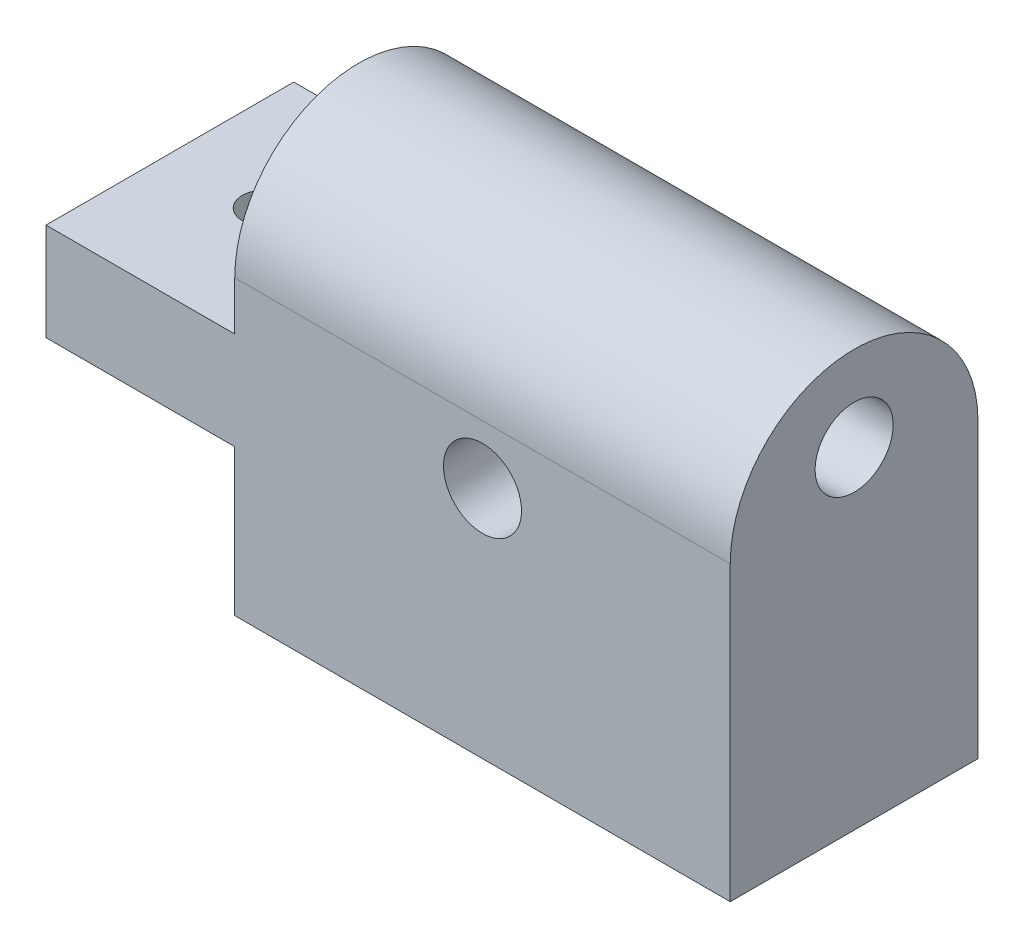
ISO-10303-21;
HEADER;
FILE_DESCRIPTION(('STEP AP214'),'2;1');
FILE_NAME('part.step','',(''),(''),'','','');
FILE_SCHEMA(('AUTOMOTIVE_DESIGN { 1 0 10303 214 1 1 1 1 }'));
ENDSEC;
DATA;
#1=APPLICATION_CONTEXT('core data for automotive mechanical design processes');
#2=APPLICATION_PROTOCOL_DEFINITION('international standard','automotive_design',2000,#1);
#3=PRODUCT_CONTEXT('',#1,'mechanical');
#4=PRODUCT('Part','Part','',(#3));
#5=PRODUCT_RELATED_PRODUCT_CATEGORY('part','',(#4));
#6=PRODUCT_DEFINITION_FORMATION('','',#4);
#7=PRODUCT_DEFINITION_CONTEXT('part definition',#1,'design');
#8=PRODUCT_DEFINITION('design','',#6,#7);
#9=PRODUCT_DEFINITION_SHAPE('','',#8);
#10=(LENGTH_UNIT() NAMED_UNIT(*) SI_UNIT(.MILLI.,.METRE.));
#11=(NAMED_UNIT(*) PLANE_ANGLE_UNIT() SI_UNIT($,.RADIAN.));
#12=(NAMED_UNIT(*) SI_UNIT($,.STERADIAN.) SOLID_ANGLE_UNIT());
#13=UNCERTAINTY_MEASURE_WITH_UNIT(LENGTH_MEASURE(1.E-05),#10,'distance_accuracy_value','');
#14=(GEOMETRIC_REPRESENTATION_CONTEXT(3) GLOBAL_UNCERTAINTY_ASSIGNED_CONTEXT((#13)) GLOBAL_UNIT_ASSIGNED_CONTEXT((#10,
#11,#12)) REPRESENTATION_CONTEXT('',''));
#15=CARTESIAN_POINT('',(0.,0.,0.));
#16=DIRECTION('',(0.,0.,1.));
#17=DIRECTION('',(1.,0.,0.));
#18=AXIS2_PLACEMENT_3D('',#15,#16,#17);
#19=CARTESIAN_POINT('',(-25.4,5.99999999999999,25.4));
#20=DIRECTION('',(1.,0.,0.));
#21=DIRECTION('',(0.,1.,0.));
#22=AXIS2_PLACEMENT_3D('',#19,#20,#21);
#23=PLANE('',#22);
#24=CARTESIAN_POINT('',(-25.4,10.,12.7));
#25=DIRECTION('',(1.,0.,0.));
#26=DIRECTION('',(0.,1.,0.));
#27=AXIS2_PLACEMENT_3D('',#24,#25,#26);
#28=CIRCLE('',#27,4.);
#29=CARTESIAN_POINT('',(-25.4,14.,12.7));
#30=VERTEX_POINT('',#29);
#31=EDGE_CURVE('E127',#30,#30,#28,.T.);
#32=ORIENTED_EDGE('',*,*,#31,.T.);
#33=EDGE_LOOP('',(#32));
#34=FACE_BOUND('',#33,.T.);
#35=DIRECTION('',(0.,0.,-1.));
#36=VECTOR('',#35,1.);
#37=CARTESIAN_POINT('',(-25.4,1.,25.4));
#38=LINE('',#37,#36);
#39=CARTESIAN_POINT('',(-25.4,0.999999999999998,25.4));
#40=VERTEX_POINT('',#39);
#41=CARTESIAN_POINT('',(-25.4,0.999999999999998,0.));
#42=VERTEX_POINT('',#41);
#43=EDGE_CURVE('E118',#40,#42,#38,.T.);
#44=ORIENTED_EDGE('',*,*,#43,.F.);
#45=DIRECTION('',(0.,-1.,0.));
#46=VECTOR('',#45,1.);
#47=CARTESIAN_POINT('',(-25.4,5.99999999999999,25.4));
#48=LINE('',#47,#46);
#49=CARTESIAN_POINT('',(-25.4,5.99999999999999,25.4));
#50=VERTEX_POINT('',#49);
#51=EDGE_CURVE('E147',#50,#40,#48,.T.);
#52=ORIENTED_EDGE('',*,*,#51,.F.);
#53=CARTESIAN_POINT('',(-25.4,6.,12.7));
#54=DIRECTION('',(1.,0.,0.));
#55=DIRECTION('',(0.,1.,0.));
#56=AXIS2_PLACEMENT_3D('',#53,#54,#55);
#57=CIRCLE('',#56,12.7);
#58=CARTESIAN_POINT('',(-25.4,5.99999999999999,0.));
#59=VERTEX_POINT('',#58);
#60=EDGE_CURVE('E136',#59,#50,#57,.T.);
#61=ORIENTED_EDGE('',*,*,#60,.F.);
#62=DIRECTION('',(0.,-1.,0.));
#63=VECTOR('',#62,1.);
#64=CARTESIAN_POINT('',(-25.4,5.99999999999999,0.));
#65=LINE('',#64,#63);
#66=EDGE_CURVE('E57',#59,#42,#65,.T.);
#67=ORIENTED_EDGE('',*,*,#66,.T.);
#68=EDGE_LOOP('',(#44,#52,#61,#67));
#69=FACE_BOUND('',#68,.T.);
#70=ADVANCED_FACE('F34',(#34,#69),#23,.F.);
#71=DIRECTION('',(0.,0.,1.));
#72=VECTOR('',#71,1.);
#73=CARTESIAN_POINT('',(-25.4,-9.,25.4));
#74=LINE('',#73,#72);
#75=CARTESIAN_POINT('',(-25.4,-9.,0.));
#76=VERTEX_POINT('',#75);
#77=CARTESIAN_POINT('',(-25.4,-9.,25.4));
#78=VERTEX_POINT('',#77);
#79=EDGE_CURVE('E49',#76,#78,#74,.T.);
#80=ORIENTED_EDGE('',*,*,#79,.F.);
#81=CARTESIAN_POINT('',(-25.4,-24.,0.));
#82=VERTEX_POINT('',#81);
#83=EDGE_CURVE('E123',#76,#82,#65,.T.);
#84=ORIENTED_EDGE('',*,*,#83,.T.);
#85=DIRECTION('',(0.,0.,-1.));
#86=VECTOR('',#85,1.);
#87=CARTESIAN_POINT('',(-25.4,-24.,25.4));
#88=LINE('',#87,#86);
#89=CARTESIAN_POINT('',(-25.4,-24.,25.4));
#90=VERTEX_POINT('',#89);
#91=EDGE_CURVE('E11',#90,#82,#88,.T.);
#92=ORIENTED_EDGE('',*,*,#91,.F.);
#93=EDGE_CURVE('E151',#78,#90,#48,.T.);
#94=ORIENTED_EDGE('',*,*,#93,.F.);
#95=EDGE_LOOP('',(#80,#84,#92,#94));
#96=FACE_BOUND('',#95,.T.);
#97=ADVANCED_FACE('F210',(#96),#23,.F.);
#98=CARTESIAN_POINT('',(0.,0.,25.4));
#99=DIRECTION('',(0.,0.,1.));
#100=DIRECTION('',(1.,0.,0.));
#101=AXIS2_PLACEMENT_3D('',#98,#99,#100);
#102=PLANE('',#101);
#103=DIRECTION('',(0.,1.,0.));
#104=VECTOR('',#103,1.);
#105=CARTESIAN_POINT('',(25.4,-24.,25.4));
#106=LINE('',#105,#104);
#107=CARTESIAN_POINT('',(25.4,-24.,25.4));
#108=VERTEX_POINT('',#107);
#109=CARTESIAN_POINT('',(25.4,5.99999999999999,25.4));
#110=VERTEX_POINT('',#109);
#111=EDGE_CURVE('E153',#108,#110,#106,.T.);
#112=ORIENTED_EDGE('',*,*,#111,.T.);
#113=DIRECTION('',(-1.,0.,0.));
#114=VECTOR('',#113,1.);
#115=CARTESIAN_POINT('',(25.4,5.99999999999999,25.4));
#116=LINE('',#115,#114);
#117=EDGE_CURVE('E155',#110,#50,#116,.T.);
#118=ORIENTED_EDGE('',*,*,#117,.T.);
#119=ORIENTED_EDGE('',*,*,#51,.T.);
#120=DIRECTION('',(1.,0.,0.));
#121=VECTOR('',#120,1.);
#122=CARTESIAN_POINT('',(-44.7499994,0.999999999999996,25.4));
#123=LINE('',#122,#121);
#124=CARTESIAN_POINT('',(-44.7499994,0.999999999999996,25.4));
#125=VERTEX_POINT('',#124);
#126=EDGE_CURVE('E129',#125,#40,#123,.T.);
#127=ORIENTED_EDGE('',*,*,#126,.F.);
#128=DIRECTION('',(0.,1.,0.));
#129=VECTOR('',#128,1.);
#130=CARTESIAN_POINT('',(-44.7499994,-9.00000000000001,25.4));
#131=LINE('',#130,#129);
#132=CARTESIAN_POINT('',(-44.7499994,-9.00000000000001,25.4));
#133=VERTEX_POINT('',#132);
#134=EDGE_CURVE('E108',#133,#125,#131,.T.);
#135=ORIENTED_EDGE('',*,*,#134,.F.);
#136=DIRECTION('',(1.,0.,0.));
#137=VECTOR('',#136,1.);
#138=CARTESIAN_POINT('',(-44.7499994,-9.00000000000001,25.4));
#139=LINE('',#138,#137);
#140=EDGE_CURVE('E105',#133,#78,#139,.T.);
#141=ORIENTED_EDGE('',*,*,#140,.T.);
#142=ORIENTED_EDGE('',*,*,#93,.T.);
#143=DIRECTION('',(1.,0.,0.));
#144=VECTOR('',#143,1.);
#145=CARTESIAN_POINT('',(-25.4,-24.,25.4));
#146=LINE('',#145,#144);
#147=EDGE_CURVE('E150',#90,#108,#146,.T.);
#148=ORIENTED_EDGE('',*,*,#147,.T.);
#149=EDGE_LOOP('',(#112,#118,#119,#127,#135,#141,#142,#148));
#150=FACE_BOUND('',#149,.T.);
#151=CARTESIAN_POINT('',(0.,0.,25.4));
#152=DIRECTION('',(0.,0.,1.));
#153=DIRECTION('',(1.,0.,0.));
#154=AXIS2_PLACEMENT_3D('',#151,#152,#153);
#155=CIRCLE('',#154,4.);
#156=CARTESIAN_POINT('',(4.,0.,25.4));
#157=VERTEX_POINT('',#156);
#158=EDGE_CURVE('E142',#157,#157,#155,.T.);
#159=ORIENTED_EDGE('',*,*,#158,.F.);
#160=EDGE_LOOP('',(#159));
#161=FACE_BOUND('',#160,.T.);
#162=ADVANCED_FACE('F181',(#150,#161),#102,.T.);
#163=CARTESIAN_POINT('',(0.,0.,0.));
#164=DIRECTION('',(0.,0.,1.));
#165=DIRECTION('',(1.,0.,0.));
#166=AXIS2_PLACEMENT_3D('',#163,#164,#165);
#167=PLANE('',#166);
#168=DIRECTION('',(1.,0.,0.));
#169=VECTOR('',#168,1.);
#170=CARTESIAN_POINT('',(-25.4,-24.,0.));
#171=LINE('',#170,#169);
#172=CARTESIAN_POINT('',(25.4,-24.,0.));
#173=VERTEX_POINT('',#172);
#174=EDGE_CURVE('E158',#82,#173,#171,.T.);
#175=ORIENTED_EDGE('',*,*,#174,.F.);
#176=ORIENTED_EDGE('',*,*,#83,.F.);
#177=DIRECTION('',(1.,0.,0.));
#178=VECTOR('',#177,1.);
#179=CARTESIAN_POINT('',(-44.7499994,-9.00000000000001,0.));
#180=LINE('',#179,#178);
#181=CARTESIAN_POINT('',(-44.7499994,-9.00000000000001,0.));
#182=VERTEX_POINT('',#181);
#183=EDGE_CURVE('E103',#182,#76,#180,.T.);
#184=ORIENTED_EDGE('',*,*,#183,.F.);
#185=DIRECTION('',(0.,-1.,0.));
#186=VECTOR('',#185,1.);
#187=CARTESIAN_POINT('',(-44.7499994,-9.00000000000001,0.));
#188=LINE('',#187,#186);
#189=CARTESIAN_POINT('',(-44.7499994,0.999999999999992,0.));
#190=VERTEX_POINT('',#189);
#191=EDGE_CURVE('E109',#190,#182,#188,.T.);
#192=ORIENTED_EDGE('',*,*,#191,.F.);
#193=DIRECTION('',(1.,0.,0.));
#194=VECTOR('',#193,1.);
#195=CARTESIAN_POINT('',(-44.7499994,0.999999999999992,0.));
#196=LINE('',#195,#194);
#197=EDGE_CURVE('E190',#190,#42,#196,.T.);
#198=ORIENTED_EDGE('',*,*,#197,.T.);
#199=ORIENTED_EDGE('',*,*,#66,.F.);
#200=DIRECTION('',(-1.,0.,0.));
#201=VECTOR('',#200,1.);
#202=CARTESIAN_POINT('',(25.4,5.99999999999999,0.));
#203=LINE('',#202,#201);
#204=CARTESIAN_POINT('',(25.4,5.99999999999999,0.));
#205=VERTEX_POINT('',#204);
#206=EDGE_CURVE('E162',#205,#59,#203,.T.);
#207=ORIENTED_EDGE('',*,*,#206,.F.);
#208=DIRECTION('',(0.,1.,0.));
#209=VECTOR('',#208,1.);
#210=CARTESIAN_POINT('',(25.4,-24.,0.));
#211=LINE('',#210,#209);
#212=EDGE_CURVE('E160',#173,#205,#211,.T.);
#213=ORIENTED_EDGE('',*,*,#212,.F.);
#214=EDGE_LOOP('',(#175,#176,#184,#192,#198,#199,#207,#213));
#215=FACE_BOUND('',#214,.T.);
#216=CARTESIAN_POINT('',(0.,0.,0.));
#217=DIRECTION('',(0.,0.,1.));
#218=DIRECTION('',(1.,0.,0.));
#219=AXIS2_PLACEMENT_3D('',#216,#217,#218);
#220=CIRCLE('',#219,4.);
#221=CARTESIAN_POINT('',(4.,0.,0.));
#222=VERTEX_POINT('',#221);
#223=EDGE_CURVE('E139',#222,#222,#220,.T.);
#224=ORIENTED_EDGE('',*,*,#223,.T.);
#225=EDGE_LOOP('',(#224));
#226=FACE_BOUND('',#225,.T.);
#227=ADVANCED_FACE('F121',(#215,#226),#167,.F.);
#228=CARTESIAN_POINT('',(-25.4,-24.,25.4));
#229=DIRECTION('',(0.,1.,0.));
#230=DIRECTION('',(0.,0.,1.));
#231=AXIS2_PLACEMENT_3D('',#228,#229,#230);
#232=PLANE('',#231);
#233=ORIENTED_EDGE('',*,*,#174,.T.);
#234=DIRECTION('',(0.,0.,-1.));
#235=VECTOR('',#234,1.);
#236=CARTESIAN_POINT('',(25.4,-24.,25.4));
#237=LINE('',#236,#235);
#238=EDGE_CURVE('E42',#108,#173,#237,.T.);
#239=ORIENTED_EDGE('',*,*,#238,.F.);
#240=ORIENTED_EDGE('',*,*,#147,.F.);
#241=ORIENTED_EDGE('',*,*,#91,.T.);
#242=EDGE_LOOP('',(#233,#239,#240,#241));
#243=FACE_BOUND('',#242,.T.);
#244=ADVANCED_FACE('F238',(#243),#232,.F.);
#245=CARTESIAN_POINT('',(25.4,-24.,25.4));
#246=DIRECTION('',(-1.,0.,0.));
#247=DIRECTION('',(0.,-1.,0.));
#248=AXIS2_PLACEMENT_3D('',#245,#246,#247);
#249=PLANE('',#248);
#250=ORIENTED_EDGE('',*,*,#212,.T.);
#251=CARTESIAN_POINT('',(25.4,5.99999999999999,12.7));
#252=DIRECTION('',(1.,0.,0.));
#253=DIRECTION('',(0.,1.,0.));
#254=AXIS2_PLACEMENT_3D('',#251,#252,#253);
#255=CIRCLE('',#254,12.7);
#256=EDGE_CURVE('E134',#205,#110,#255,.T.);
#257=ORIENTED_EDGE('',*,*,#256,.T.);
#258=ORIENTED_EDGE('',*,*,#111,.F.);
#259=ORIENTED_EDGE('',*,*,#238,.T.);
#260=EDGE_LOOP('',(#250,#257,#258,#259));
#261=FACE_BOUND('',#260,.T.);
#262=CARTESIAN_POINT('',(25.4,9.99999999999999,12.7));
#263=DIRECTION('',(1.,0.,0.));
#264=DIRECTION('',(0.,1.,0.));
#265=AXIS2_PLACEMENT_3D('',#262,#263,#264);
#266=CIRCLE('',#265,4.);
#267=CARTESIAN_POINT('',(25.4,14.,12.7));
#268=VERTEX_POINT('',#267);
#269=EDGE_CURVE('E124',#268,#268,#266,.T.);
#270=ORIENTED_EDGE('',*,*,#269,.F.);
#271=EDGE_LOOP('',(#270));
#272=FACE_BOUND('',#271,.T.);
#273=ADVANCED_FACE('F170',(#261,#272),#249,.F.);
#274=CARTESIAN_POINT('',(0.,0.,25.4));
#275=DIRECTION('',(0.,0.,-1.));
#276=DIRECTION('',(-1.,0.,0.));
#277=AXIS2_PLACEMENT_3D('',#274,#275,#276);
#278=CYLINDRICAL_SURFACE('',#277,4.);
#279=ORIENTED_EDGE('',*,*,#158,.T.);
#280=EDGE_LOOP('',(#279));
#281=FACE_BOUND('',#280,.T.);
#282=ORIENTED_EDGE('',*,*,#223,.F.);
#283=EDGE_LOOP('',(#282));
#284=FACE_BOUND('',#283,.T.);
#285=ADVANCED_FACE('F227',(#281,#284),#278,.F.);
#286=CARTESIAN_POINT('',(-25.4,6.,12.7));
#287=DIRECTION('',(1.,0.,0.));
#288=DIRECTION('',(0.,1.,0.));
#289=AXIS2_PLACEMENT_3D('',#286,#287,#288);
#290=CYLINDRICAL_SURFACE('',#289,12.7);
#291=ORIENTED_EDGE('',*,*,#256,.F.);
#292=ORIENTED_EDGE('',*,*,#206,.T.);
#293=ORIENTED_EDGE('',*,*,#60,.T.);
#294=ORIENTED_EDGE('',*,*,#117,.F.);
#295=EDGE_LOOP('',(#291,#292,#293,#294));
#296=FACE_BOUND('',#295,.T.);
#297=ADVANCED_FACE('F178',(#296),#290,.T.);
#298=CARTESIAN_POINT('',(-25.4,10.,12.7));
#299=DIRECTION('',(1.,0.,0.));
#300=DIRECTION('',(0.,1.,0.));
#301=AXIS2_PLACEMENT_3D('',#298,#299,#300);
#302=CYLINDRICAL_SURFACE('',#301,4.);
#303=ORIENTED_EDGE('',*,*,#269,.T.);
#304=EDGE_LOOP('',(#303));
#305=FACE_BOUND('',#304,.T.);
#306=ORIENTED_EDGE('',*,*,#31,.F.);
#307=EDGE_LOOP('',(#306));
#308=FACE_BOUND('',#307,.T.);
#309=ADVANCED_FACE('F217',(#305,#308),#302,.F.);
#310=CARTESIAN_POINT('',(-44.7499994,-9.00000000000001,25.4));
#311=DIRECTION('',(0.,1.,0.));
#312=DIRECTION('',(-1.,0.,0.));
#313=AXIS2_PLACEMENT_3D('',#310,#311,#312);
#314=PLANE('',#313);
#315=CARTESIAN_POINT('',(-35.0749997,-9.00000000000001,12.7));
#316=DIRECTION('',(0.,-1.,0.));
#317=DIRECTION('',(0.,0.,-1.));
#318=AXIS2_PLACEMENT_3D('',#315,#316,#317);
#319=CIRCLE('',#318,2.25);
#320=CARTESIAN_POINT('',(-35.0749997,-9.00000000000001,10.45));
#321=VERTEX_POINT('',#320);
#322=EDGE_CURVE('E194',#321,#321,#319,.T.);
#323=ORIENTED_EDGE('',*,*,#322,.F.);
#324=EDGE_LOOP('',(#323));
#325=FACE_BOUND('',#324,.T.);
#326=ORIENTED_EDGE('',*,*,#79,.T.);
#327=ORIENTED_EDGE('',*,*,#140,.F.);
#328=DIRECTION('',(0.,0.,1.));
#329=VECTOR('',#328,1.);
#330=CARTESIAN_POINT('',(-44.7499994,-9.00000000000001,25.4));
#331=LINE('',#330,#329);
#332=EDGE_CURVE('E99',#182,#133,#331,.T.);
#333=ORIENTED_EDGE('',*,*,#332,.F.);
#334=ORIENTED_EDGE('',*,*,#183,.T.);
#335=EDGE_LOOP('',(#326,#327,#333,#334));
#336=FACE_BOUND('',#335,.T.);
#337=ADVANCED_FACE('F101',(#325,#336),#314,.F.);
#338=CARTESIAN_POINT('',(-44.7499994,0.999999999999996,25.4));
#339=DIRECTION('',(0.,-1.,0.));
#340=DIRECTION('',(1.,0.,0.));
#341=AXIS2_PLACEMENT_3D('',#338,#339,#340);
#342=PLANE('',#341);
#343=CARTESIAN_POINT('',(-35.0749997,0.999999999999996,12.7));
#344=DIRECTION('',(0.,-1.,0.));
#345=DIRECTION('',(1.,0.,0.));
#346=AXIS2_PLACEMENT_3D('',#343,#344,#345);
#347=CIRCLE('',#346,2.25);
#348=CARTESIAN_POINT('',(-32.8249997,0.999999999999996,12.7));
#349=VERTEX_POINT('',#348);
#350=EDGE_CURVE('E37',#349,#349,#347,.T.);
#351=ORIENTED_EDGE('',*,*,#350,.T.);
#352=EDGE_LOOP('',(#351));
#353=FACE_BOUND('',#352,.T.);
#354=ORIENTED_EDGE('',*,*,#43,.T.);
#355=ORIENTED_EDGE('',*,*,#197,.F.);
#356=DIRECTION('',(0.,0.,-1.));
#357=VECTOR('',#356,1.);
#358=CARTESIAN_POINT('',(-44.7499994,0.999999999999996,25.4));
#359=LINE('',#358,#357);
#360=EDGE_CURVE('E114',#125,#190,#359,.T.);
#361=ORIENTED_EDGE('',*,*,#360,.F.);
#362=ORIENTED_EDGE('',*,*,#126,.T.);
#363=EDGE_LOOP('',(#354,#355,#361,#362));
#364=FACE_BOUND('',#363,.T.);
#365=ADVANCED_FACE('F191',(#353,#364),#342,.F.);
#366=CARTESIAN_POINT('',(-44.7499994,0.,0.));
#367=DIRECTION('',(-1.,0.,0.));
#368=DIRECTION('',(0.,-1.,0.));
#369=AXIS2_PLACEMENT_3D('',#366,#367,#368);
#370=PLANE('',#369);
#371=ORIENTED_EDGE('',*,*,#191,.T.);
#372=ORIENTED_EDGE('',*,*,#332,.T.);
#373=ORIENTED_EDGE('',*,*,#134,.T.);
#374=ORIENTED_EDGE('',*,*,#360,.T.);
#375=EDGE_LOOP('',(#371,#372,#373,#374));
#376=FACE_BOUND('',#375,.T.);
#377=ADVANCED_FACE('F112',(#376),#370,.T.);
#378=CARTESIAN_POINT('',(-35.0749997,-9.00000000000001,12.7));
#379=DIRECTION('',(0.,-1.,0.));
#380=DIRECTION('',(0.,0.,-1.));
#381=AXIS2_PLACEMENT_3D('',#378,#379,#380);
#382=CYLINDRICAL_SURFACE('',#381,2.25);
#383=ORIENTED_EDGE('',*,*,#322,.T.);
#384=EDGE_LOOP('',(#383));
#385=FACE_BOUND('',#384,.T.);
#386=ORIENTED_EDGE('',*,*,#350,.F.);
#387=EDGE_LOOP('',(#386));
#388=FACE_BOUND('',#387,.T.);
#389=ADVANCED_FACE('F202',(#385,#388),#382,.F.);
#390=CLOSED_SHELL('',(#70,#97,#162,#227,#244,#273,#285,#297,#309,#337,#365,#377,#389));
#391=MANIFOLD_SOLID_BREP('B2',#390);
#392=ADVANCED_BREP_SHAPE_REPRESENTATION('',(#18,#391),#14);
#393=SHAPE_DEFINITION_REPRESENTATION(#9,#392);
ENDSEC;
END-ISO-10303-21;
